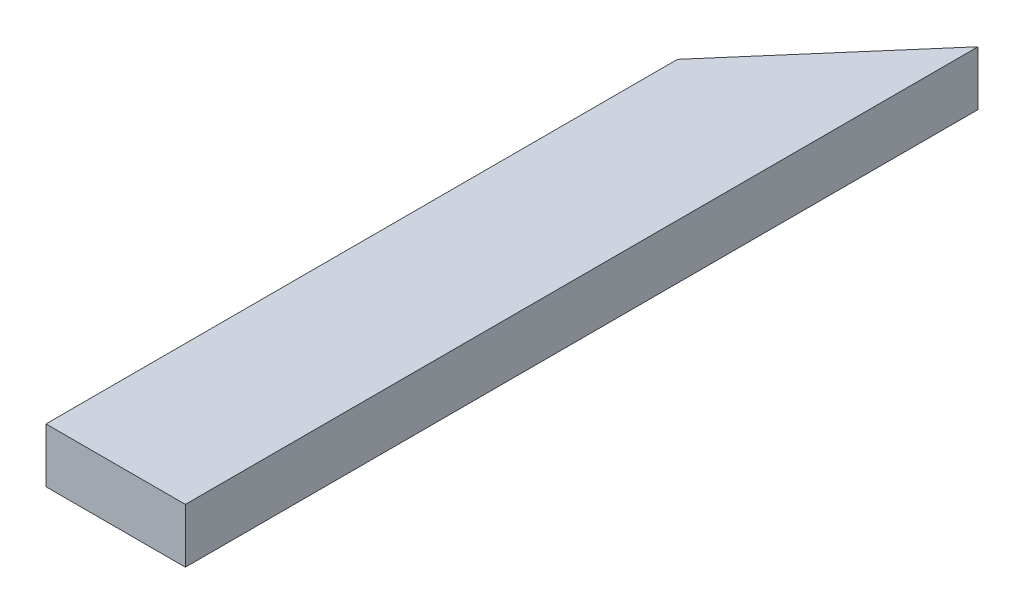
ISO-10303-21;
HEADER;
FILE_DESCRIPTION(('STEP AP214'),'2;1');
FILE_NAME('part.step','',(''),(''),'','','');
FILE_SCHEMA(('AUTOMOTIVE_DESIGN { 1 0 10303 214 1 1 1 1 }'));
ENDSEC;
DATA;
#1=APPLICATION_CONTEXT('core data for automotive mechanical design processes');
#2=APPLICATION_PROTOCOL_DEFINITION('international standard','automotive_design',2000,#1);
#3=PRODUCT_CONTEXT('',#1,'mechanical');
#4=PRODUCT('Part','Part','',(#3));
#5=PRODUCT_RELATED_PRODUCT_CATEGORY('part','',(#4));
#6=PRODUCT_DEFINITION_FORMATION('','',#4);
#7=PRODUCT_DEFINITION_CONTEXT('part definition',#1,'design');
#8=PRODUCT_DEFINITION('design','',#6,#7);
#9=PRODUCT_DEFINITION_SHAPE('','',#8);
#10=(LENGTH_UNIT() NAMED_UNIT(*) SI_UNIT(.MILLI.,.METRE.));
#11=(NAMED_UNIT(*) PLANE_ANGLE_UNIT() SI_UNIT($,.RADIAN.));
#12=(NAMED_UNIT(*) SI_UNIT($,.STERADIAN.) SOLID_ANGLE_UNIT());
#13=UNCERTAINTY_MEASURE_WITH_UNIT(LENGTH_MEASURE(1.E-05),#10,'distance_accuracy_value','');
#14=(GEOMETRIC_REPRESENTATION_CONTEXT(3) GLOBAL_UNCERTAINTY_ASSIGNED_CONTEXT((#13)) GLOBAL_UNIT_ASSIGNED_CONTEXT((#10,
#11,#12)) REPRESENTATION_CONTEXT('',''));
#15=CARTESIAN_POINT('',(0.,0.,0.));
#16=DIRECTION('',(0.,0.,1.));
#17=DIRECTION('',(1.,0.,0.));
#18=AXIS2_PLACEMENT_3D('',#15,#16,#17);
#19=CARTESIAN_POINT('',(0.,12.7,0.));
#20=DIRECTION('',(1.,0.,0.));
#21=DIRECTION('',(0.,0.,-1.));
#22=AXIS2_PLACEMENT_3D('',#19,#20,#21);
#23=PLANE('',#22);
#24=DIRECTION('',(0.,0.,1.));
#25=VECTOR('',#24,1.);
#26=CARTESIAN_POINT('',(0.,0.,0.));
#27=LINE('',#26,#25);
#28=CARTESIAN_POINT('',(0.,0.,-147.32));
#29=VERTEX_POINT('',#28);
#30=CARTESIAN_POINT('',(0.,0.,0.));
#31=VERTEX_POINT('',#30);
#32=EDGE_CURVE('E96',#29,#31,#27,.T.);
#33=ORIENTED_EDGE('',*,*,#32,.T.);
#34=DIRECTION('',(0.,-1.,0.));
#35=VECTOR('',#34,1.);
#36=CARTESIAN_POINT('',(0.,12.7,0.));
#37=LINE('',#36,#35);
#38=CARTESIAN_POINT('',(0.,12.7,0.));
#39=VERTEX_POINT('',#38);
#40=EDGE_CURVE('E11',#39,#31,#37,.T.);
#41=ORIENTED_EDGE('',*,*,#40,.F.);
#42=DIRECTION('',(0.,0.,1.));
#43=VECTOR('',#42,1.);
#44=CARTESIAN_POINT('',(0.,12.7,0.));
#45=LINE('',#44,#43);
#46=CARTESIAN_POINT('',(0.,12.7,-147.32));
#47=VERTEX_POINT('',#46);
#48=EDGE_CURVE('E84',#47,#39,#45,.T.);
#49=ORIENTED_EDGE('',*,*,#48,.F.);
#50=DIRECTION('',(0.,-1.,0.));
#51=VECTOR('',#50,1.);
#52=CARTESIAN_POINT('',(0.,12.7,-147.32));
#53=LINE('',#52,#51);
#54=EDGE_CURVE('E92',#47,#29,#53,.T.);
#55=ORIENTED_EDGE('',*,*,#54,.T.);
#56=EDGE_LOOP('',(#33,#41,#49,#55));
#57=FACE_BOUND('',#56,.T.);
#58=ADVANCED_FACE('F33',(#57),#23,.F.);
#59=CARTESIAN_POINT('',(0.,12.7,0.));
#60=DIRECTION('',(0.,0.,-1.));
#61=DIRECTION('',(-1.,0.,0.));
#62=AXIS2_PLACEMENT_3D('',#59,#60,#61);
#63=PLANE('',#62);
#64=DIRECTION('',(1.,0.,0.));
#65=VECTOR('',#64,1.);
#66=CARTESIAN_POINT('',(0.,0.,0.));
#67=LINE('',#66,#65);
#68=CARTESIAN_POINT('',(32.512,0.,0.));
#69=VERTEX_POINT('',#68);
#70=EDGE_CURVE('E88',#31,#69,#67,.T.);
#71=ORIENTED_EDGE('',*,*,#70,.T.);
#72=DIRECTION('',(0.,-1.,0.));
#73=VECTOR('',#72,1.);
#74=CARTESIAN_POINT('',(32.512,12.7,0.));
#75=LINE('',#74,#73);
#76=CARTESIAN_POINT('',(32.512,12.7,0.));
#77=VERTEX_POINT('',#76);
#78=EDGE_CURVE('E41',#77,#69,#75,.T.);
#79=ORIENTED_EDGE('',*,*,#78,.F.);
#80=DIRECTION('',(1.,0.,0.));
#81=VECTOR('',#80,1.);
#82=CARTESIAN_POINT('',(0.,12.7,0.));
#83=LINE('',#82,#81);
#84=EDGE_CURVE('E79',#39,#77,#83,.T.);
#85=ORIENTED_EDGE('',*,*,#84,.F.);
#86=ORIENTED_EDGE('',*,*,#40,.T.);
#87=EDGE_LOOP('',(#71,#79,#85,#86));
#88=FACE_BOUND('',#87,.T.);
#89=ADVANCED_FACE('F87',(#88),#63,.F.);
#90=CARTESIAN_POINT('',(32.512,12.7,0.));
#91=DIRECTION('',(-1.,0.,0.));
#92=DIRECTION('',(0.,0.,1.));
#93=AXIS2_PLACEMENT_3D('',#90,#91,#92);
#94=PLANE('',#93);
#95=DIRECTION('',(0.,0.,-1.));
#96=VECTOR('',#95,1.);
#97=CARTESIAN_POINT('',(32.512,0.,0.));
#98=LINE('',#97,#96);
#99=CARTESIAN_POINT('',(32.512,0.,-184.912));
#100=VERTEX_POINT('',#99);
#101=EDGE_CURVE('E66',#69,#100,#98,.T.);
#102=ORIENTED_EDGE('',*,*,#101,.T.);
#103=DIRECTION('',(0.,-1.,0.));
#104=VECTOR('',#103,1.);
#105=CARTESIAN_POINT('',(32.512,12.7,-184.912));
#106=LINE('',#105,#104);
#107=CARTESIAN_POINT('',(32.512,12.7,-184.912));
#108=VERTEX_POINT('',#107);
#109=EDGE_CURVE('E89',#108,#100,#106,.T.);
#110=ORIENTED_EDGE('',*,*,#109,.F.);
#111=DIRECTION('',(0.,0.,-1.));
#112=VECTOR('',#111,1.);
#113=CARTESIAN_POINT('',(32.512,12.7,0.));
#114=LINE('',#113,#112);
#115=EDGE_CURVE('E82',#77,#108,#114,.T.);
#116=ORIENTED_EDGE('',*,*,#115,.F.);
#117=ORIENTED_EDGE('',*,*,#78,.T.);
#118=EDGE_LOOP('',(#102,#110,#116,#117));
#119=FACE_BOUND('',#118,.T.);
#120=ADVANCED_FACE('F90',(#119),#94,.F.);
#121=CARTESIAN_POINT('',(0.,12.7,-147.32));
#122=DIRECTION('',(0.756363172452144,0.,0.654151932931584));
#123=DIRECTION('',(0.654151932931584,0.,-0.756363172452144));
#124=AXIS2_PLACEMENT_3D('',#121,#122,#123);
#125=PLANE('',#124);
#126=DIRECTION('',(-0.654151932931584,0.,0.756363172452144));
#127=VECTOR('',#126,1.);
#128=CARTESIAN_POINT('',(0.,0.,-147.32));
#129=LINE('',#128,#127);
#130=EDGE_CURVE('E72',#100,#29,#129,.T.);
#131=ORIENTED_EDGE('',*,*,#130,.T.);
#132=ORIENTED_EDGE('',*,*,#54,.F.);
#133=DIRECTION('',(-0.654151932931584,0.,0.756363172452144));
#134=VECTOR('',#133,1.);
#135=CARTESIAN_POINT('',(0.,12.7,-147.32));
#136=LINE('',#135,#134);
#137=EDGE_CURVE('E49',#108,#47,#136,.T.);
#138=ORIENTED_EDGE('',*,*,#137,.F.);
#139=ORIENTED_EDGE('',*,*,#109,.T.);
#140=EDGE_LOOP('',(#131,#132,#138,#139));
#141=FACE_BOUND('',#140,.T.);
#142=ADVANCED_FACE('F103',(#141),#125,.F.);
#143=CARTESIAN_POINT('',(0.,12.7,0.));
#144=DIRECTION('',(0.,-1.,0.));
#145=DIRECTION('',(0.,0.,-1.));
#146=AXIS2_PLACEMENT_3D('',#143,#144,#145);
#147=PLANE('',#146);
#148=ORIENTED_EDGE('',*,*,#48,.T.);
#149=ORIENTED_EDGE('',*,*,#84,.T.);
#150=ORIENTED_EDGE('',*,*,#115,.T.);
#151=ORIENTED_EDGE('',*,*,#137,.T.);
#152=EDGE_LOOP('',(#148,#149,#150,#151));
#153=FACE_BOUND('',#152,.T.);
#154=ADVANCED_FACE('F80',(#153),#147,.F.);
#155=CARTESIAN_POINT('',(0.,0.,0.));
#156=DIRECTION('',(0.,-1.,0.));
#157=DIRECTION('',(0.,0.,-1.));
#158=AXIS2_PLACEMENT_3D('',#155,#156,#157);
#159=PLANE('',#158);
#160=ORIENTED_EDGE('',*,*,#32,.F.);
#161=ORIENTED_EDGE('',*,*,#130,.F.);
#162=ORIENTED_EDGE('',*,*,#101,.F.);
#163=ORIENTED_EDGE('',*,*,#70,.F.);
#164=EDGE_LOOP('',(#160,#161,#162,#163));
#165=FACE_BOUND('',#164,.T.);
#166=ADVANCED_FACE('F106',(#165),#159,.T.);
#167=CLOSED_SHELL('',(#58,#89,#120,#142,#154,#166));
#168=MANIFOLD_SOLID_BREP('B2',#167);
#169=ADVANCED_BREP_SHAPE_REPRESENTATION('',(#18,#168),#14);
#170=SHAPE_DEFINITION_REPRESENTATION(#9,#169);
ENDSEC;
END-ISO-10303-21;
